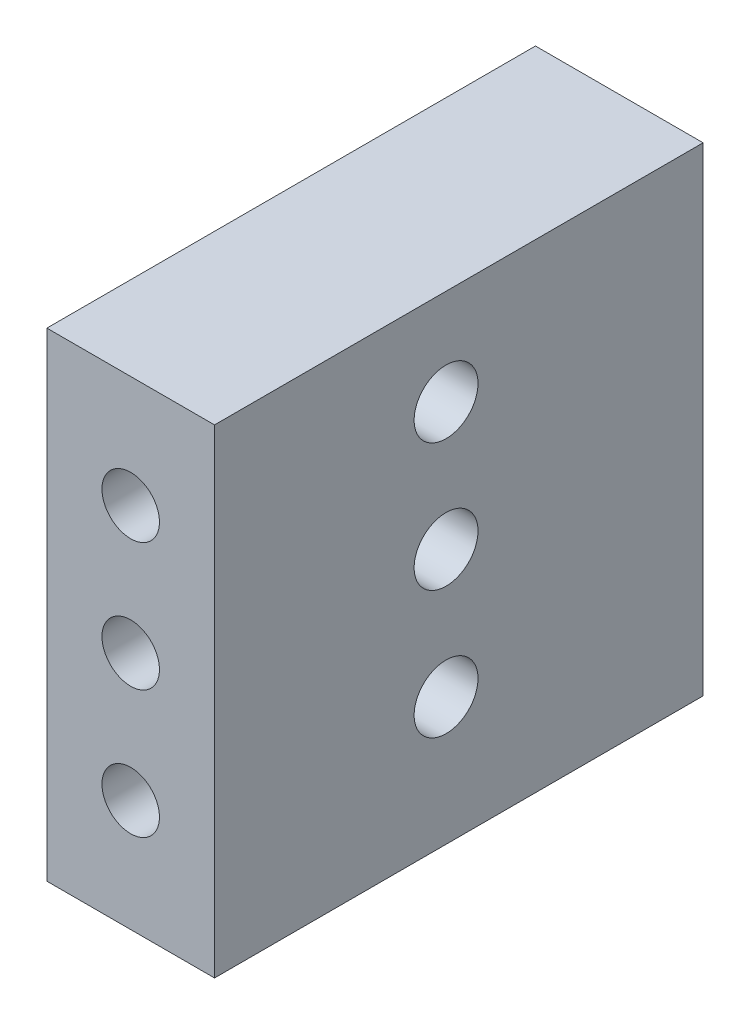
ISO-10303-21;
HEADER;
FILE_DESCRIPTION(('STEP AP214'),'2;1');
FILE_NAME('part.step','',(''),(''),'','','');
FILE_SCHEMA(('AUTOMOTIVE_DESIGN { 1 0 10303 214 1 1 1 1 }'));
ENDSEC;
DATA;
#1=APPLICATION_CONTEXT('core data for automotive mechanical design processes');
#2=APPLICATION_PROTOCOL_DEFINITION('international standard','automotive_design',2000,#1);
#3=PRODUCT_CONTEXT('',#1,'mechanical');
#4=PRODUCT('Part','Part','',(#3));
#5=PRODUCT_RELATED_PRODUCT_CATEGORY('part','',(#4));
#6=PRODUCT_DEFINITION_FORMATION('','',#4);
#7=PRODUCT_DEFINITION_CONTEXT('part definition',#1,'design');
#8=PRODUCT_DEFINITION('design','',#6,#7);
#9=PRODUCT_DEFINITION_SHAPE('','',#8);
#10=(LENGTH_UNIT() NAMED_UNIT(*) SI_UNIT(.MILLI.,.METRE.));
#11=(NAMED_UNIT(*) PLANE_ANGLE_UNIT() SI_UNIT($,.RADIAN.));
#12=(NAMED_UNIT(*) SI_UNIT($,.STERADIAN.) SOLID_ANGLE_UNIT());
#13=UNCERTAINTY_MEASURE_WITH_UNIT(LENGTH_MEASURE(1.E-05),#10,'distance_accuracy_value','');
#14=(GEOMETRIC_REPRESENTATION_CONTEXT(3) GLOBAL_UNCERTAINTY_ASSIGNED_CONTEXT((#13)) GLOBAL_UNIT_ASSIGNED_CONTEXT((#10,
#11,#12)) REPRESENTATION_CONTEXT('',''));
#15=CARTESIAN_POINT('',(0.,0.,0.));
#16=DIRECTION('',(0.,0.,1.));
#17=DIRECTION('',(1.,0.,0.));
#18=AXIS2_PLACEMENT_3D('',#15,#16,#17);
#19=CARTESIAN_POINT('',(0.,30.,0.));
#20=DIRECTION('',(1.,0.,0.));
#21=DIRECTION('',(0.,0.,-1.));
#22=AXIS2_PLACEMENT_3D('',#19,#20,#21);
#23=PLANE('',#22);
#24=CARTESIAN_POINT('',(0.,24.,-22.));
#25=DIRECTION('',(1.,0.,0.));
#26=DIRECTION('',(0.,0.,-1.));
#27=AXIS2_PLACEMENT_3D('',#24,#25,#26);
#28=CIRCLE('',#27,2.00000000000001);
#29=CARTESIAN_POINT('',(0.,24.,-24.));
#30=VERTEX_POINT('',#29);
#31=EDGE_CURVE('E86',#30,#30,#28,.T.);
#32=ORIENTED_EDGE('',*,*,#31,.T.);
#33=EDGE_LOOP('',(#32));
#34=FACE_BOUND('',#33,.T.);
#35=CARTESIAN_POINT('',(0.,16.,-22.));
#36=DIRECTION('',(1.,0.,0.));
#37=DIRECTION('',(0.,0.,-1.));
#38=AXIS2_PLACEMENT_3D('',#35,#36,#37);
#39=CIRCLE('',#38,2.00000000000001);
#40=CARTESIAN_POINT('',(0.,16.,-24.));
#41=VERTEX_POINT('',#40);
#42=EDGE_CURVE('E90',#41,#41,#39,.T.);
#43=ORIENTED_EDGE('',*,*,#42,.T.);
#44=EDGE_LOOP('',(#43));
#45=FACE_BOUND('',#44,.T.);
#46=CARTESIAN_POINT('',(0.,8.,-22.));
#47=DIRECTION('',(1.,0.,0.));
#48=DIRECTION('',(0.,0.,-1.));
#49=AXIS2_PLACEMENT_3D('',#46,#47,#48);
#50=CIRCLE('',#49,2.);
#51=CARTESIAN_POINT('',(0.,8.,-24.));
#52=VERTEX_POINT('',#51);
#53=EDGE_CURVE('E99',#52,#52,#50,.T.);
#54=ORIENTED_EDGE('',*,*,#53,.T.);
#55=EDGE_LOOP('',(#54));
#56=FACE_BOUND('',#55,.T.);
#57=DIRECTION('',(0.,0.,1.));
#58=VECTOR('',#57,1.);
#59=CARTESIAN_POINT('',(0.,0.,0.));
#60=LINE('',#59,#58);
#61=CARTESIAN_POINT('',(0.,0.,-38.1));
#62=VERTEX_POINT('',#61);
#63=CARTESIAN_POINT('',(0.,0.,-7.5));
#64=VERTEX_POINT('',#63);
#65=EDGE_CURVE('E82',#62,#64,#60,.T.);
#66=ORIENTED_EDGE('',*,*,#65,.T.);
#67=DIRECTION('',(0.,1.,0.));
#68=VECTOR('',#67,1.);
#69=CARTESIAN_POINT('',(0.,0.,-7.5));
#70=LINE('',#69,#68);
#71=CARTESIAN_POINT('',(0.,30.,-7.5));
#72=VERTEX_POINT('',#71);
#73=EDGE_CURVE('E48',#64,#72,#70,.T.);
#74=ORIENTED_EDGE('',*,*,#73,.T.);
#75=DIRECTION('',(0.,0.,1.));
#76=VECTOR('',#75,1.);
#77=CARTESIAN_POINT('',(0.,30.,0.));
#78=LINE('',#77,#76);
#79=CARTESIAN_POINT('',(0.,30.,-38.1));
#80=VERTEX_POINT('',#79);
#81=EDGE_CURVE('E77',#80,#72,#78,.T.);
#82=ORIENTED_EDGE('',*,*,#81,.F.);
#83=DIRECTION('',(0.,-1.,0.));
#84=VECTOR('',#83,1.);
#85=CARTESIAN_POINT('',(0.,30.,-38.1));
#86=LINE('',#85,#84);
#87=EDGE_CURVE('E41',#80,#62,#86,.T.);
#88=ORIENTED_EDGE('',*,*,#87,.T.);
#89=EDGE_LOOP('',(#66,#74,#82,#88));
#90=FACE_BOUND('',#89,.T.);
#91=ADVANCED_FACE('F33',(#34,#45,#56,#90),#23,.F.);
#92=CARTESIAN_POINT('',(10.5,30.,0.));
#93=DIRECTION('',(-1.,0.,0.));
#94=DIRECTION('',(0.,0.,1.));
#95=AXIS2_PLACEMENT_3D('',#92,#93,#94);
#96=PLANE('',#95);
#97=CARTESIAN_POINT('',(10.5,24.,-22.));
#98=DIRECTION('',(1.,0.,0.));
#99=DIRECTION('',(0.,0.,-1.));
#100=AXIS2_PLACEMENT_3D('',#97,#98,#99);
#101=CIRCLE('',#100,2.00000000000001);
#102=CARTESIAN_POINT('',(10.5,24.,-24.));
#103=VERTEX_POINT('',#102);
#104=EDGE_CURVE('E102',#103,#103,#101,.T.);
#105=ORIENTED_EDGE('',*,*,#104,.F.);
#106=EDGE_LOOP('',(#105));
#107=FACE_BOUND('',#106,.T.);
#108=CARTESIAN_POINT('',(10.5,16.,-22.));
#109=DIRECTION('',(1.,0.,0.));
#110=DIRECTION('',(0.,0.,-1.));
#111=AXIS2_PLACEMENT_3D('',#108,#109,#110);
#112=CIRCLE('',#111,2.00000000000001);
#113=CARTESIAN_POINT('',(10.5,16.,-24.));
#114=VERTEX_POINT('',#113);
#115=EDGE_CURVE('E106',#114,#114,#112,.T.);
#116=ORIENTED_EDGE('',*,*,#115,.F.);
#117=EDGE_LOOP('',(#116));
#118=FACE_BOUND('',#117,.T.);
#119=CARTESIAN_POINT('',(10.5,8.,-22.));
#120=DIRECTION('',(1.,0.,0.));
#121=DIRECTION('',(0.,0.,-1.));
#122=AXIS2_PLACEMENT_3D('',#119,#120,#121);
#123=CIRCLE('',#122,2.);
#124=CARTESIAN_POINT('',(10.5,8.,-24.));
#125=VERTEX_POINT('',#124);
#126=EDGE_CURVE('E103',#125,#125,#123,.T.);
#127=ORIENTED_EDGE('',*,*,#126,.F.);
#128=EDGE_LOOP('',(#127));
#129=FACE_BOUND('',#128,.T.);
#130=DIRECTION('',(0.,0.,-1.));
#131=VECTOR('',#130,1.);
#132=CARTESIAN_POINT('',(10.5,30.,0.));
#133=LINE('',#132,#131);
#134=CARTESIAN_POINT('',(10.5,30.,-7.5));
#135=VERTEX_POINT('',#134);
#136=CARTESIAN_POINT('',(10.5,30.,-38.1));
#137=VERTEX_POINT('',#136);
#138=EDGE_CURVE('E94',#135,#137,#133,.T.);
#139=ORIENTED_EDGE('',*,*,#138,.F.);
#140=DIRECTION('',(0.,1.,0.));
#141=VECTOR('',#140,1.);
#142=CARTESIAN_POINT('',(10.5,0.,-7.5));
#143=LINE('',#142,#141);
#144=CARTESIAN_POINT('',(10.5,0.,-7.5));
#145=VERTEX_POINT('',#144);
#146=EDGE_CURVE('E144',#145,#135,#143,.T.);
#147=ORIENTED_EDGE('',*,*,#146,.F.);
#148=DIRECTION('',(0.,0.,-1.));
#149=VECTOR('',#148,1.);
#150=CARTESIAN_POINT('',(10.5,0.,0.));
#151=LINE('',#150,#149);
#152=CARTESIAN_POINT('',(10.5,0.,-38.1));
#153=VERTEX_POINT('',#152);
#154=EDGE_CURVE('E78',#145,#153,#151,.T.);
#155=ORIENTED_EDGE('',*,*,#154,.T.);
#156=DIRECTION('',(0.,-1.,0.));
#157=VECTOR('',#156,1.);
#158=CARTESIAN_POINT('',(10.5,30.,-38.1));
#159=LINE('',#158,#157);
#160=EDGE_CURVE('E11',#137,#153,#159,.T.);
#161=ORIENTED_EDGE('',*,*,#160,.F.);
#162=EDGE_LOOP('',(#139,#147,#155,#161));
#163=FACE_BOUND('',#162,.T.);
#164=ADVANCED_FACE('F166',(#107,#118,#129,#163),#96,.F.);
#165=CARTESIAN_POINT('',(0.,30.,-38.1));
#166=DIRECTION('',(0.,0.,1.));
#167=DIRECTION('',(1.,0.,0.));
#168=AXIS2_PLACEMENT_3D('',#165,#166,#167);
#169=PLANE('',#168);
#170=CARTESIAN_POINT('',(6.24999999999999,26.,-38.1));
#171=DIRECTION('',(0.,0.,-1.));
#172=DIRECTION('',(-1.,0.,0.));
#173=AXIS2_PLACEMENT_3D('',#170,#171,#172);
#174=CIRCLE('',#173,1.8);
#175=CARTESIAN_POINT('',(4.44999999999999,26.,-38.1));
#176=VERTEX_POINT('',#175);
#177=EDGE_CURVE('E134',#176,#176,#174,.T.);
#178=ORIENTED_EDGE('',*,*,#177,.F.);
#179=EDGE_LOOP('',(#178));
#180=FACE_BOUND('',#179,.T.);
#181=CARTESIAN_POINT('',(6.25,18.,-38.1));
#182=DIRECTION('',(0.,0.,-1.));
#183=DIRECTION('',(-1.,0.,0.));
#184=AXIS2_PLACEMENT_3D('',#181,#182,#183);
#185=CIRCLE('',#184,1.8);
#186=CARTESIAN_POINT('',(4.45,18.,-38.1));
#187=VERTEX_POINT('',#186);
#188=EDGE_CURVE('E128',#187,#187,#185,.T.);
#189=ORIENTED_EDGE('',*,*,#188,.F.);
#190=EDGE_LOOP('',(#189));
#191=FACE_BOUND('',#190,.T.);
#192=CARTESIAN_POINT('',(6.25,10.,-38.1));
#193=DIRECTION('',(0.,0.,-1.));
#194=DIRECTION('',(-1.,0.,0.));
#195=AXIS2_PLACEMENT_3D('',#192,#193,#194);
#196=CIRCLE('',#195,1.8);
#197=CARTESIAN_POINT('',(4.45,10.,-38.1));
#198=VERTEX_POINT('',#197);
#199=EDGE_CURVE('E121',#198,#198,#196,.T.);
#200=ORIENTED_EDGE('',*,*,#199,.F.);
#201=EDGE_LOOP('',(#200));
#202=FACE_BOUND('',#201,.T.);
#203=DIRECTION('',(-1.,0.,0.));
#204=VECTOR('',#203,1.);
#205=CARTESIAN_POINT('',(0.,0.,-38.1));
#206=LINE('',#205,#204);
#207=EDGE_CURVE('E69',#153,#62,#206,.T.);
#208=ORIENTED_EDGE('',*,*,#207,.T.);
#209=ORIENTED_EDGE('',*,*,#87,.F.);
#210=DIRECTION('',(-1.,0.,0.));
#211=VECTOR('',#210,1.);
#212=CARTESIAN_POINT('',(0.,30.,-38.1));
#213=LINE('',#212,#211);
#214=EDGE_CURVE('E57',#137,#80,#213,.T.);
#215=ORIENTED_EDGE('',*,*,#214,.F.);
#216=ORIENTED_EDGE('',*,*,#160,.T.);
#217=EDGE_LOOP('',(#208,#209,#215,#216));
#218=FACE_BOUND('',#217,.T.);
#219=ADVANCED_FACE('F71',(#180,#191,#202,#218),#169,.F.);
#220=CARTESIAN_POINT('',(0.,30.,0.));
#221=DIRECTION('',(0.,-1.,0.));
#222=DIRECTION('',(0.,0.,-1.));
#223=AXIS2_PLACEMENT_3D('',#220,#221,#222);
#224=PLANE('',#223);
#225=ORIENTED_EDGE('',*,*,#81,.T.);
#226=DIRECTION('',(-1.,0.,0.));
#227=VECTOR('',#226,1.);
#228=CARTESIAN_POINT('',(0.,30.,-7.5));
#229=LINE('',#228,#227);
#230=EDGE_CURVE('E148',#135,#72,#229,.T.);
#231=ORIENTED_EDGE('',*,*,#230,.F.);
#232=ORIENTED_EDGE('',*,*,#138,.T.);
#233=ORIENTED_EDGE('',*,*,#214,.T.);
#234=EDGE_LOOP('',(#225,#231,#232,#233));
#235=FACE_BOUND('',#234,.T.);
#236=ADVANCED_FACE('F157',(#235),#224,.F.);
#237=CARTESIAN_POINT('',(0.,0.,0.));
#238=DIRECTION('',(0.,-1.,0.));
#239=DIRECTION('',(0.,0.,-1.));
#240=AXIS2_PLACEMENT_3D('',#237,#238,#239);
#241=PLANE('',#240);
#242=DIRECTION('',(-1.,0.,0.));
#243=VECTOR('',#242,1.);
#244=CARTESIAN_POINT('',(0.,0.,-7.5));
#245=LINE('',#244,#243);
#246=EDGE_CURVE('E85',#145,#64,#245,.T.);
#247=ORIENTED_EDGE('',*,*,#246,.T.);
#248=ORIENTED_EDGE('',*,*,#65,.F.);
#249=ORIENTED_EDGE('',*,*,#207,.F.);
#250=ORIENTED_EDGE('',*,*,#154,.F.);
#251=EDGE_LOOP('',(#247,#248,#249,#250));
#252=FACE_BOUND('',#251,.T.);
#253=ADVANCED_FACE('F84',(#252),#241,.T.);
#254=CARTESIAN_POINT('',(-0.500000000000004,8.,-22.));
#255=DIRECTION('',(1.,0.,0.));
#256=DIRECTION('',(0.,0.,-1.));
#257=AXIS2_PLACEMENT_3D('',#254,#255,#256);
#258=CYLINDRICAL_SURFACE('',#257,2.);
#259=ORIENTED_EDGE('',*,*,#126,.T.);
#260=EDGE_LOOP('',(#259));
#261=FACE_BOUND('',#260,.T.);
#262=ORIENTED_EDGE('',*,*,#53,.F.);
#263=EDGE_LOOP('',(#262));
#264=FACE_BOUND('',#263,.T.);
#265=ADVANCED_FACE('F164',(#261,#264),#258,.F.);
#266=CARTESIAN_POINT('',(-0.500000000000004,16.,-22.));
#267=DIRECTION('',(1.,0.,0.));
#268=DIRECTION('',(0.,0.,-1.));
#269=AXIS2_PLACEMENT_3D('',#266,#267,#268);
#270=CYLINDRICAL_SURFACE('',#269,2.00000000000001);
#271=ORIENTED_EDGE('',*,*,#115,.T.);
#272=EDGE_LOOP('',(#271));
#273=FACE_BOUND('',#272,.T.);
#274=ORIENTED_EDGE('',*,*,#42,.F.);
#275=EDGE_LOOP('',(#274));
#276=FACE_BOUND('',#275,.T.);
#277=ADVANCED_FACE('F183',(#273,#276),#270,.F.);
#278=CARTESIAN_POINT('',(-0.500000000000004,24.,-22.));
#279=DIRECTION('',(1.,0.,0.));
#280=DIRECTION('',(0.,0.,-1.));
#281=AXIS2_PLACEMENT_3D('',#278,#279,#280);
#282=CYLINDRICAL_SURFACE('',#281,2.00000000000001);
#283=ORIENTED_EDGE('',*,*,#104,.T.);
#284=EDGE_LOOP('',(#283));
#285=FACE_BOUND('',#284,.T.);
#286=ORIENTED_EDGE('',*,*,#31,.F.);
#287=EDGE_LOOP('',(#286));
#288=FACE_BOUND('',#287,.T.);
#289=ADVANCED_FACE('F188',(#285,#288),#282,.F.);
#290=CARTESIAN_POINT('',(6.25,10.,-29.1));
#291=DIRECTION('',(0.,0.,-1.));
#292=DIRECTION('',(-1.,0.,0.));
#293=AXIS2_PLACEMENT_3D('',#290,#291,#292);
#294=CYLINDRICAL_SURFACE('',#293,1.8);
#295=CARTESIAN_POINT('',(6.25,10.,-29.1));
#296=DIRECTION('',(0.,0.,-1.));
#297=DIRECTION('',(-1.,0.,0.));
#298=AXIS2_PLACEMENT_3D('',#295,#296,#297);
#299=CIRCLE('',#298,1.8);
#300=CARTESIAN_POINT('',(4.45,10.,-29.1));
#301=VERTEX_POINT('',#300);
#302=EDGE_CURVE('E124',#301,#301,#299,.T.);
#303=ORIENTED_EDGE('',*,*,#302,.F.);
#304=EDGE_LOOP('',(#303));
#305=FACE_BOUND('',#304,.T.);
#306=ORIENTED_EDGE('',*,*,#199,.T.);
#307=EDGE_LOOP('',(#306));
#308=FACE_BOUND('',#307,.T.);
#309=ADVANCED_FACE('F194',(#305,#308),#294,.F.);
#310=CARTESIAN_POINT('',(6.25,10.,-29.1));
#311=DIRECTION('',(0.,0.,-1.));
#312=DIRECTION('',(-1.,0.,0.));
#313=AXIS2_PLACEMENT_3D('',#310,#311,#312);
#314=PLANE('',#313);
#315=ORIENTED_EDGE('',*,*,#302,.T.);
#316=EDGE_LOOP('',(#315));
#317=FACE_BOUND('',#316,.T.);
#318=ADVANCED_FACE('F222',(#317),#314,.T.);
#319=CARTESIAN_POINT('',(6.25,18.,-29.1));
#320=DIRECTION('',(0.,0.,-1.));
#321=DIRECTION('',(-1.,0.,0.));
#322=AXIS2_PLACEMENT_3D('',#319,#320,#321);
#323=CYLINDRICAL_SURFACE('',#322,1.8);
#324=CARTESIAN_POINT('',(6.25,18.,-29.1));
#325=DIRECTION('',(0.,0.,-1.));
#326=DIRECTION('',(-1.,0.,0.));
#327=AXIS2_PLACEMENT_3D('',#324,#325,#326);
#328=CIRCLE('',#327,1.8);
#329=CARTESIAN_POINT('',(4.45,18.,-29.1));
#330=VERTEX_POINT('',#329);
#331=EDGE_CURVE('E131',#330,#330,#328,.T.);
#332=ORIENTED_EDGE('',*,*,#331,.F.);
#333=EDGE_LOOP('',(#332));
#334=FACE_BOUND('',#333,.T.);
#335=ORIENTED_EDGE('',*,*,#188,.T.);
#336=EDGE_LOOP('',(#335));
#337=FACE_BOUND('',#336,.T.);
#338=ADVANCED_FACE('F226',(#334,#337),#323,.F.);
#339=CARTESIAN_POINT('',(6.25,18.,-29.1));
#340=DIRECTION('',(0.,0.,-1.));
#341=DIRECTION('',(-1.,0.,0.));
#342=AXIS2_PLACEMENT_3D('',#339,#340,#341);
#343=PLANE('',#342);
#344=ORIENTED_EDGE('',*,*,#331,.T.);
#345=EDGE_LOOP('',(#344));
#346=FACE_BOUND('',#345,.T.);
#347=ADVANCED_FACE('F230',(#346),#343,.T.);
#348=CARTESIAN_POINT('',(6.24999999999999,26.,-29.1));
#349=DIRECTION('',(0.,0.,-1.));
#350=DIRECTION('',(-1.,0.,0.));
#351=AXIS2_PLACEMENT_3D('',#348,#349,#350);
#352=CYLINDRICAL_SURFACE('',#351,1.8);
#353=CARTESIAN_POINT('',(6.24999999999999,26.,-29.1));
#354=DIRECTION('',(0.,0.,-1.));
#355=DIRECTION('',(-1.,0.,0.));
#356=AXIS2_PLACEMENT_3D('',#353,#354,#355);
#357=CIRCLE('',#356,1.8);
#358=CARTESIAN_POINT('',(4.44999999999999,26.,-29.1));
#359=VERTEX_POINT('',#358);
#360=EDGE_CURVE('E116',#359,#359,#357,.T.);
#361=ORIENTED_EDGE('',*,*,#360,.F.);
#362=EDGE_LOOP('',(#361));
#363=FACE_BOUND('',#362,.T.);
#364=ORIENTED_EDGE('',*,*,#177,.T.);
#365=EDGE_LOOP('',(#364));
#366=FACE_BOUND('',#365,.T.);
#367=ADVANCED_FACE('F234',(#363,#366),#352,.F.);
#368=CARTESIAN_POINT('',(6.24999999999999,26.,-29.1));
#369=DIRECTION('',(0.,0.,-1.));
#370=DIRECTION('',(-1.,0.,0.));
#371=AXIS2_PLACEMENT_3D('',#368,#369,#370);
#372=PLANE('',#371);
#373=ORIENTED_EDGE('',*,*,#360,.T.);
#374=EDGE_LOOP('',(#373));
#375=FACE_BOUND('',#374,.T.);
#376=ADVANCED_FACE('F238',(#375),#372,.T.);
#377=CARTESIAN_POINT('',(0.,0.,-7.5));
#378=DIRECTION('',(0.,0.,-1.));
#379=DIRECTION('',(-1.,0.,0.));
#380=AXIS2_PLACEMENT_3D('',#377,#378,#379);
#381=PLANE('',#380);
#382=CARTESIAN_POINT('',(5.25,15.,-7.5));
#383=DIRECTION('',(0.,0.,-1.));
#384=DIRECTION('',(-1.,0.,0.));
#385=AXIS2_PLACEMENT_3D('',#382,#383,#384);
#386=CIRCLE('',#385,1.8);
#387=CARTESIAN_POINT('',(3.45,15.,-7.5));
#388=VERTEX_POINT('',#387);
#389=EDGE_CURVE('E141',#388,#388,#386,.F.);
#390=ORIENTED_EDGE('',*,*,#389,.F.);
#391=EDGE_LOOP('',(#390));
#392=FACE_BOUND('',#391,.T.);
#393=ORIENTED_EDGE('',*,*,#230,.T.);
#394=ORIENTED_EDGE('',*,*,#73,.F.);
#395=ORIENTED_EDGE('',*,*,#246,.F.);
#396=ORIENTED_EDGE('',*,*,#146,.T.);
#397=EDGE_LOOP('',(#393,#394,#395,#396));
#398=FACE_BOUND('',#397,.T.);
#399=CARTESIAN_POINT('',(5.25,23.,-7.5));
#400=DIRECTION('',(0.,0.,-1.));
#401=DIRECTION('',(-1.,0.,0.));
#402=AXIS2_PLACEMENT_3D('',#399,#400,#401);
#403=CIRCLE('',#402,1.8);
#404=CARTESIAN_POINT('',(3.45,23.,-7.5));
#405=VERTEX_POINT('',#404);
#406=EDGE_CURVE('E36',#405,#405,#403,.F.);
#407=ORIENTED_EDGE('',*,*,#406,.F.);
#408=EDGE_LOOP('',(#407));
#409=FACE_BOUND('',#408,.T.);
#410=CARTESIAN_POINT('',(5.25,7.,-7.5));
#411=DIRECTION('',(0.,0.,-1.));
#412=DIRECTION('',(-1.,0.,0.));
#413=AXIS2_PLACEMENT_3D('',#410,#411,#412);
#414=CIRCLE('',#413,1.8);
#415=CARTESIAN_POINT('',(3.45,7.,-7.5));
#416=VERTEX_POINT('',#415);
#417=EDGE_CURVE('E125',#416,#416,#414,.F.);
#418=ORIENTED_EDGE('',*,*,#417,.F.);
#419=EDGE_LOOP('',(#418));
#420=FACE_BOUND('',#419,.T.);
#421=ADVANCED_FACE('F152',(#392,#398,#409,#420),#381,.F.);
#422=CARTESIAN_POINT('',(5.25,15.,-17.));
#423=DIRECTION('',(0.,0.,1.));
#424=DIRECTION('',(1.,0.,0.));
#425=AXIS2_PLACEMENT_3D('',#422,#423,#424);
#426=PLANE('',#425);
#427=CARTESIAN_POINT('',(5.25,15.,-17.));
#428=DIRECTION('',(0.,0.,1.));
#429=DIRECTION('',(1.,0.,0.));
#430=AXIS2_PLACEMENT_3D('',#427,#428,#429);
#431=CIRCLE('',#430,1.8);
#432=CARTESIAN_POINT('',(7.05,15.,-17.));
#433=VERTEX_POINT('',#432);
#434=EDGE_CURVE('E115',#433,#433,#431,.T.);
#435=ORIENTED_EDGE('',*,*,#434,.T.);
#436=EDGE_LOOP('',(#435));
#437=FACE_BOUND('',#436,.T.);
#438=ADVANCED_FACE('F208',(#437),#426,.T.);
#439=CARTESIAN_POINT('',(5.25,15.,-17.));
#440=DIRECTION('',(0.,0.,1.));
#441=DIRECTION('',(1.,0.,0.));
#442=AXIS2_PLACEMENT_3D('',#439,#440,#441);
#443=CYLINDRICAL_SURFACE('',#442,1.8);
#444=ORIENTED_EDGE('',*,*,#389,.T.);
#445=EDGE_LOOP('',(#444));
#446=FACE_BOUND('',#445,.T.);
#447=ORIENTED_EDGE('',*,*,#434,.F.);
#448=EDGE_LOOP('',(#447));
#449=FACE_BOUND('',#448,.T.);
#450=ADVANCED_FACE('F204',(#446,#449),#443,.F.);
#451=CARTESIAN_POINT('',(5.25,7.,-17.));
#452=DIRECTION('',(0.,0.,1.));
#453=DIRECTION('',(1.,0.,0.));
#454=AXIS2_PLACEMENT_3D('',#451,#452,#453);
#455=PLANE('',#454);
#456=CARTESIAN_POINT('',(5.25,7.,-17.));
#457=DIRECTION('',(0.,0.,1.));
#458=DIRECTION('',(1.,0.,0.));
#459=AXIS2_PLACEMENT_3D('',#456,#457,#458);
#460=CIRCLE('',#459,1.8);
#461=CARTESIAN_POINT('',(7.05,7.,-17.));
#462=VERTEX_POINT('',#461);
#463=EDGE_CURVE('E112',#462,#462,#460,.T.);
#464=ORIENTED_EDGE('',*,*,#463,.T.);
#465=EDGE_LOOP('',(#464));
#466=FACE_BOUND('',#465,.T.);
#467=ADVANCED_FACE('F200',(#466),#455,.T.);
#468=CARTESIAN_POINT('',(5.25,7.,-17.));
#469=DIRECTION('',(0.,0.,1.));
#470=DIRECTION('',(1.,0.,0.));
#471=AXIS2_PLACEMENT_3D('',#468,#469,#470);
#472=CYLINDRICAL_SURFACE('',#471,1.8);
#473=ORIENTED_EDGE('',*,*,#417,.T.);
#474=EDGE_LOOP('',(#473));
#475=FACE_BOUND('',#474,.T.);
#476=ORIENTED_EDGE('',*,*,#463,.F.);
#477=EDGE_LOOP('',(#476));
#478=FACE_BOUND('',#477,.T.);
#479=ADVANCED_FACE('F196',(#475,#478),#472,.F.);
#480=CARTESIAN_POINT('',(5.25,23.,-17.));
#481=DIRECTION('',(0.,0.,1.));
#482=DIRECTION('',(1.,0.,0.));
#483=AXIS2_PLACEMENT_3D('',#480,#481,#482);
#484=PLANE('',#483);
#485=CARTESIAN_POINT('',(5.25,23.,-17.));
#486=DIRECTION('',(0.,0.,1.));
#487=DIRECTION('',(1.,0.,0.));
#488=AXIS2_PLACEMENT_3D('',#485,#486,#487);
#489=CIRCLE('',#488,1.8);
#490=CARTESIAN_POINT('',(7.05,23.,-17.));
#491=VERTEX_POINT('',#490);
#492=EDGE_CURVE('E107',#491,#491,#489,.T.);
#493=ORIENTED_EDGE('',*,*,#492,.T.);
#494=EDGE_LOOP('',(#493));
#495=FACE_BOUND('',#494,.T.);
#496=ADVANCED_FACE('F199',(#495),#484,.T.);
#497=CARTESIAN_POINT('',(5.25,23.,-17.));
#498=DIRECTION('',(0.,0.,1.));
#499=DIRECTION('',(1.,0.,0.));
#500=AXIS2_PLACEMENT_3D('',#497,#498,#499);
#501=CYLINDRICAL_SURFACE('',#500,1.8);
#502=ORIENTED_EDGE('',*,*,#406,.T.);
#503=EDGE_LOOP('',(#502));
#504=FACE_BOUND('',#503,.T.);
#505=ORIENTED_EDGE('',*,*,#492,.F.);
#506=EDGE_LOOP('',(#505));
#507=FACE_BOUND('',#506,.T.);
#508=ADVANCED_FACE('F213',(#504,#507),#501,.F.);
#509=CLOSED_SHELL('',(#91,#164,#219,#236,#253,#265,#277,#289,#309,#318,#338,#347,#367,#376,#421,
#438,#450,#467,#479,#496,#508));
#510=MANIFOLD_SOLID_BREP('B2',#509);
#511=ADVANCED_BREP_SHAPE_REPRESENTATION('',(#18,#510),#14);
#512=SHAPE_DEFINITION_REPRESENTATION(#9,#511);
ENDSEC;
END-ISO-10303-21;
